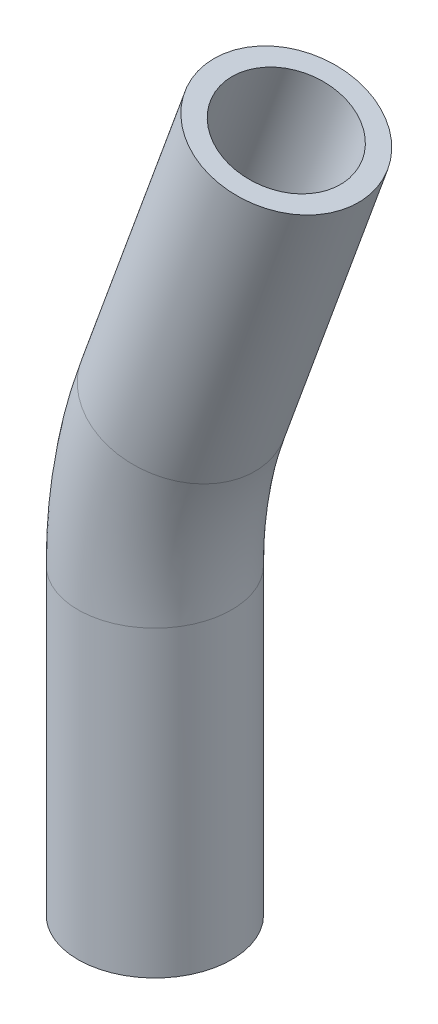
ISO-10303-21;
HEADER;
FILE_DESCRIPTION(('STEP AP214'),'2;1');
FILE_NAME('part.step','',(''),(''),'','','');
FILE_SCHEMA(('AUTOMOTIVE_DESIGN { 1 0 10303 214 1 1 1 1 }'));
ENDSEC;
DATA;
#1=APPLICATION_CONTEXT('core data for automotive mechanical design processes');
#2=APPLICATION_PROTOCOL_DEFINITION('international standard','automotive_design',2000,#1);
#3=PRODUCT_CONTEXT('',#1,'mechanical');
#4=PRODUCT('Part','Part','',(#3));
#5=PRODUCT_RELATED_PRODUCT_CATEGORY('part','',(#4));
#6=PRODUCT_DEFINITION_FORMATION('','',#4);
#7=PRODUCT_DEFINITION_CONTEXT('part definition',#1,'design');
#8=PRODUCT_DEFINITION('design','',#6,#7);
#9=PRODUCT_DEFINITION_SHAPE('','',#8);
#10=(LENGTH_UNIT() NAMED_UNIT(*) SI_UNIT(.MILLI.,.METRE.));
#11=(NAMED_UNIT(*) PLANE_ANGLE_UNIT() SI_UNIT($,.RADIAN.));
#12=(NAMED_UNIT(*) SI_UNIT($,.STERADIAN.) SOLID_ANGLE_UNIT());
#13=UNCERTAINTY_MEASURE_WITH_UNIT(LENGTH_MEASURE(1.E-05),#10,'distance_accuracy_value','');
#14=(GEOMETRIC_REPRESENTATION_CONTEXT(3) GLOBAL_UNCERTAINTY_ASSIGNED_CONTEXT((#13)) GLOBAL_UNIT_ASSIGNED_CONTEXT((#10,
#11,#12)) REPRESENTATION_CONTEXT('',''));
#15=CARTESIAN_POINT('',(0.,0.,0.));
#16=DIRECTION('',(0.,0.,1.));
#17=DIRECTION('',(1.,0.,0.));
#18=AXIS2_PLACEMENT_3D('',#15,#16,#17);
#19=CARTESIAN_POINT('',(0.,0.,0.));
#20=DIRECTION('',(0.,1.,0.));
#21=DIRECTION('',(-1.,0.,0.));
#22=AXIS2_PLACEMENT_3D('',#19,#20,#21);
#23=CYLINDRICAL_SURFACE('',#22,4.);
#24=CARTESIAN_POINT('',(0.,15.7681524629968,0.));
#25=DIRECTION('',(0.,1.,0.));
#26=DIRECTION('',(0.,0.,1.));
#27=AXIS2_PLACEMENT_3D('',#24,#25,#26);
#28=CIRCLE('',#27,4.);
#29=CARTESIAN_POINT('',(-3.99999999999999,15.7681524629968,0.));
#30=VERTEX_POINT('',#29);
#31=EDGE_CURVE('E78',#30,#30,#28,.T.);
#32=ORIENTED_EDGE('',*,*,#31,.F.);
#33=EDGE_LOOP('',(#32));
#34=FACE_BOUND('',#33,.T.);
#35=CARTESIAN_POINT('',(0.,0.,0.));
#36=DIRECTION('',(0.,1.,0.));
#37=DIRECTION('',(0.,0.,1.));
#38=AXIS2_PLACEMENT_3D('',#35,#36,#37);
#39=CIRCLE('',#38,4.);
#40=CARTESIAN_POINT('',(0.,0.,4.));
#41=VERTEX_POINT('',#40);
#42=EDGE_CURVE('E47',#41,#41,#39,.T.);
#43=ORIENTED_EDGE('',*,*,#42,.T.);
#44=EDGE_LOOP('',(#43));
#45=FACE_BOUND('',#44,.T.);
#46=ADVANCED_FACE('F32',(#34,#45),#23,.T.);
#47=CARTESIAN_POINT('',(24.,15.7681524629968,0.));
#48=DIRECTION('',(0.,0.,-1.));
#49=DIRECTION('',(-1.,0.,0.));
#50=AXIS2_PLACEMENT_3D('',#47,#48,#49);
#51=TOROIDAL_SURFACE('',#50,24.,4.);
#52=CARTESIAN_POINT('',(1.44737710113821,23.9766359028129,0.));
#53=DIRECTION('',(0.342020143325669,0.939692620785908,0.));
#54=DIRECTION('',(0.,0.,1.));
#55=AXIS2_PLACEMENT_3D('',#52,#53,#54);
#56=CIRCLE('',#55,4.);
#57=CARTESIAN_POINT('',(-2.31139338200542,25.3447164761156,0.));
#58=VERTEX_POINT('',#57);
#59=EDGE_CURVE('E36',#58,#58,#56,.T.);
#60=CARTESIAN_POINT('',(24.,15.7681524629968,0.));
#61=DIRECTION('',(0.,0.,-1.));
#62=DIRECTION('',(-1.,0.,0.));
#63=AXIS2_PLACEMENT_3D('',#60,#61,#62);
#64=CIRCLE('',#63,28.);
#65=EDGE_CURVE('',#30,#58,#64,.T.);
#66=ORIENTED_EDGE('',*,*,#31,.T.);
#67=ORIENTED_EDGE('',*,*,#59,.F.);
#68=ORIENTED_EDGE('',*,*,#65,.T.);
#69=ORIENTED_EDGE('',*,*,#65,.F.);
#70=EDGE_LOOP('',(#66,#68,#67,#69));
#71=FACE_BOUND('',#70,.T.);
#72=ADVANCED_FACE('F86',(#71),#51,.T.);
#73=CARTESIAN_POINT('',(1.44737710113822,23.9766359028129,0.));
#74=DIRECTION('',(0.342020143325669,0.939692620785908,0.));
#75=DIRECTION('',(-0.939692620785908,0.342020143325669,0.));
#76=AXIS2_PLACEMENT_3D('',#73,#74,#75);
#77=CYLINDRICAL_SURFACE('',#76,4.);
#78=CARTESIAN_POINT('',(6.84040286651339,38.7938524157182,0.));
#79=DIRECTION('',(0.342020143325669,0.939692620785908,0.));
#80=DIRECTION('',(0.,0.,1.));
#81=AXIS2_PLACEMENT_3D('',#78,#79,#80);
#82=CIRCLE('',#81,4.);
#83=CARTESIAN_POINT('',(6.84040286651339,38.7938524157182,4.));
#84=VERTEX_POINT('',#83);
#85=EDGE_CURVE('E52',#84,#84,#82,.T.);
#86=ORIENTED_EDGE('',*,*,#85,.F.);
#87=EDGE_LOOP('',(#86));
#88=FACE_BOUND('',#87,.T.);
#89=ORIENTED_EDGE('',*,*,#59,.T.);
#90=EDGE_LOOP('',(#89));
#91=FACE_BOUND('',#90,.T.);
#92=ADVANCED_FACE('F34',(#88,#91),#77,.T.);
#93=CARTESIAN_POINT('',(0.,0.,0.));
#94=DIRECTION('',(0.,1.,0.));
#95=DIRECTION('',(0.,0.,1.));
#96=AXIS2_PLACEMENT_3D('',#93,#94,#95);
#97=PLANE('',#96);
#98=CARTESIAN_POINT('',(0.,0.,0.));
#99=DIRECTION('',(0.,1.,0.));
#100=DIRECTION('',(0.,0.,1.));
#101=AXIS2_PLACEMENT_3D('',#98,#99,#100);
#102=CIRCLE('',#101,3.);
#103=CARTESIAN_POINT('',(0.,0.,3.));
#104=VERTEX_POINT('',#103);
#105=EDGE_CURVE('E73',#104,#104,#102,.F.);
#106=ORIENTED_EDGE('',*,*,#105,.F.);
#107=EDGE_LOOP('',(#106));
#108=FACE_BOUND('',#107,.T.);
#109=ORIENTED_EDGE('',*,*,#42,.F.);
#110=EDGE_LOOP('',(#109));
#111=FACE_BOUND('',#110,.T.);
#112=ADVANCED_FACE('F92',(#108,#111),#97,.F.);
#113=CARTESIAN_POINT('',(6.84040286651339,38.7938524157182,0.));
#114=DIRECTION('',(0.342020143325669,0.939692620785908,0.));
#115=DIRECTION('',(0.,0.,1.));
#116=AXIS2_PLACEMENT_3D('',#113,#114,#115);
#117=PLANE('',#116);
#118=CARTESIAN_POINT('',(6.84040286651339,38.7938524157182,0.));
#119=DIRECTION('',(0.342020143325669,0.939692620785908,0.));
#120=DIRECTION('',(0.,0.,1.));
#121=AXIS2_PLACEMENT_3D('',#118,#119,#120);
#122=CIRCLE('',#121,3.);
#123=CARTESIAN_POINT('',(6.84040286651339,38.7938524157182,3.));
#124=VERTEX_POINT('',#123);
#125=EDGE_CURVE('E11',#124,#124,#122,.F.);
#126=ORIENTED_EDGE('',*,*,#125,.T.);
#127=EDGE_LOOP('',(#126));
#128=FACE_BOUND('',#127,.T.);
#129=ORIENTED_EDGE('',*,*,#85,.T.);
#130=EDGE_LOOP('',(#129));
#131=FACE_BOUND('',#130,.T.);
#132=ADVANCED_FACE('F59',(#128,#131),#117,.T.);
#133=CARTESIAN_POINT('',(0.,0.,0.));
#134=DIRECTION('',(0.,1.,0.));
#135=DIRECTION('',(-1.,0.,0.));
#136=AXIS2_PLACEMENT_3D('',#133,#134,#135);
#137=CYLINDRICAL_SURFACE('',#136,3.);
#138=CARTESIAN_POINT('',(0.,15.7681524629968,0.));
#139=DIRECTION('',(0.,1.,0.));
#140=DIRECTION('',(0.,0.,1.));
#141=AXIS2_PLACEMENT_3D('',#138,#139,#140);
#142=CIRCLE('',#141,3.);
#143=CARTESIAN_POINT('',(-2.99999999999999,15.7681524629968,0.));
#144=VERTEX_POINT('',#143);
#145=EDGE_CURVE('E70',#144,#144,#142,.F.);
#146=ORIENTED_EDGE('',*,*,#145,.F.);
#147=EDGE_LOOP('',(#146));
#148=FACE_BOUND('',#147,.T.);
#149=ORIENTED_EDGE('',*,*,#105,.T.);
#150=EDGE_LOOP('',(#149));
#151=FACE_BOUND('',#150,.T.);
#152=ADVANCED_FACE('F100',(#148,#151),#137,.F.);
#153=CARTESIAN_POINT('',(24.,15.7681524629968,0.));
#154=DIRECTION('',(0.,0.,-1.));
#155=DIRECTION('',(-1.,0.,0.));
#156=AXIS2_PLACEMENT_3D('',#153,#154,#155);
#157=TOROIDAL_SURFACE('',#156,24.,3.);
#158=CARTESIAN_POINT('',(1.44737710113821,23.9766359028129,0.));
#159=DIRECTION('',(0.342020143325669,0.939692620785908,0.));
#160=DIRECTION('',(0.,0.,1.));
#161=AXIS2_PLACEMENT_3D('',#158,#159,#160);
#162=CIRCLE('',#161,3.);
#163=CARTESIAN_POINT('',(-1.37170076121951,25.0026963327899,0.));
#164=VERTEX_POINT('',#163);
#165=EDGE_CURVE('E41',#164,#164,#162,.F.);
#166=CARTESIAN_POINT('',(24.,15.7681524629968,0.));
#167=DIRECTION('',(0.,0.,-1.));
#168=DIRECTION('',(-1.,0.,0.));
#169=AXIS2_PLACEMENT_3D('',#166,#167,#168);
#170=CIRCLE('',#169,27.);
#171=EDGE_CURVE('',#144,#164,#170,.T.);
#172=ORIENTED_EDGE('',*,*,#145,.T.);
#173=ORIENTED_EDGE('',*,*,#165,.F.);
#174=ORIENTED_EDGE('',*,*,#171,.T.);
#175=ORIENTED_EDGE('',*,*,#171,.F.);
#176=EDGE_LOOP('',(#172,#174,#173,#175));
#177=FACE_BOUND('',#176,.T.);
#178=ADVANCED_FACE('F65',(#177),#157,.F.);
#179=CARTESIAN_POINT('',(1.44737710113822,23.9766359028129,0.));
#180=DIRECTION('',(0.342020143325669,0.939692620785908,0.));
#181=DIRECTION('',(-0.939692620785908,0.342020143325669,0.));
#182=AXIS2_PLACEMENT_3D('',#179,#180,#181);
#183=CYLINDRICAL_SURFACE('',#182,3.);
#184=ORIENTED_EDGE('',*,*,#125,.F.);
#185=EDGE_LOOP('',(#184));
#186=FACE_BOUND('',#185,.T.);
#187=ORIENTED_EDGE('',*,*,#165,.T.);
#188=EDGE_LOOP('',(#187));
#189=FACE_BOUND('',#188,.T.);
#190=ADVANCED_FACE('F62',(#186,#189),#183,.F.);
#191=CLOSED_SHELL('',(#46,#72,#92,#112,#132,#152,#178,#190));
#192=MANIFOLD_SOLID_BREP('B2',#191);
#193=ADVANCED_BREP_SHAPE_REPRESENTATION('',(#18,#192),#14);
#194=SHAPE_DEFINITION_REPRESENTATION(#9,#193);
ENDSEC;
END-ISO-10303-21;
